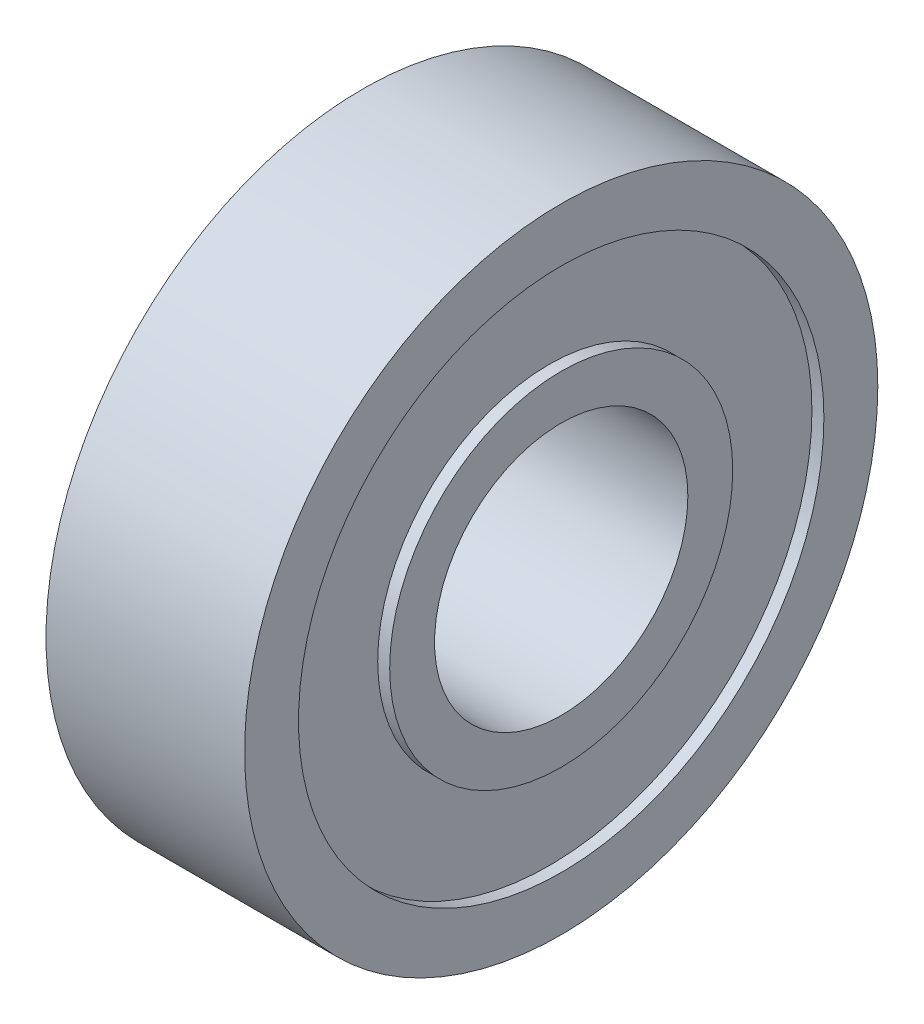
ISO-10303-21;
HEADER;
FILE_DESCRIPTION(('STEP AP214'),'2;1');
FILE_NAME('part.step','',(''),(''),'','','');
FILE_SCHEMA(('AUTOMOTIVE_DESIGN { 1 0 10303 214 1 1 1 1 }'));
ENDSEC;
DATA;
#1=APPLICATION_CONTEXT('core data for automotive mechanical design processes');
#2=APPLICATION_PROTOCOL_DEFINITION('international standard','automotive_design',2000,#1);
#3=PRODUCT_CONTEXT('',#1,'mechanical');
#4=PRODUCT('Part','Part','',(#3));
#5=PRODUCT_RELATED_PRODUCT_CATEGORY('part','',(#4));
#6=PRODUCT_DEFINITION_FORMATION('','',#4);
#7=PRODUCT_DEFINITION_CONTEXT('part definition',#1,'design');
#8=PRODUCT_DEFINITION('design','',#6,#7);
#9=PRODUCT_DEFINITION_SHAPE('','',#8);
#10=(LENGTH_UNIT() NAMED_UNIT(*) SI_UNIT(.MILLI.,.METRE.));
#11=(NAMED_UNIT(*) PLANE_ANGLE_UNIT() SI_UNIT($,.RADIAN.));
#12=(NAMED_UNIT(*) SI_UNIT($,.STERADIAN.) SOLID_ANGLE_UNIT());
#13=UNCERTAINTY_MEASURE_WITH_UNIT(LENGTH_MEASURE(1.E-05),#10,'distance_accuracy_value','');
#14=(GEOMETRIC_REPRESENTATION_CONTEXT(3) GLOBAL_UNCERTAINTY_ASSIGNED_CONTEXT((#13)) GLOBAL_UNIT_ASSIGNED_CONTEXT((#10,
#11,#12)) REPRESENTATION_CONTEXT('',''));
#15=CARTESIAN_POINT('',(0.,0.,0.));
#16=DIRECTION('',(0.,0.,1.));
#17=DIRECTION('',(1.,0.,0.));
#18=AXIS2_PLACEMENT_3D('',#15,#16,#17);
#19=CARTESIAN_POINT('',(-2.4892,3.175,0.));
#20=DIRECTION('',(-1.,0.,0.));
#21=DIRECTION('',(0.,0.,1.));
#22=AXIS2_PLACEMENT_3D('',#19,#20,#21);
#23=PLANE('',#22);
#24=CARTESIAN_POINT('',(-2.4892,0.,0.));
#25=DIRECTION('',(1.,0.,0.));
#26=DIRECTION('',(0.,0.,-1.));
#27=AXIS2_PLACEMENT_3D('',#24,#25,#26);
#28=CIRCLE('',#27,3.175);
#29=CARTESIAN_POINT('',(-2.4892,0.,-3.175));
#30=VERTEX_POINT('',#29);
#31=EDGE_CURVE('E72',#30,#30,#28,.T.);
#32=ORIENTED_EDGE('',*,*,#31,.T.);
#33=EDGE_LOOP('',(#32));
#34=FACE_BOUND('',#33,.T.);
#35=CARTESIAN_POINT('',(-2.4892,0.,0.));
#36=DIRECTION('',(1.,0.,0.));
#37=DIRECTION('',(0.,0.,-1.));
#38=AXIS2_PLACEMENT_3D('',#35,#36,#37);
#39=CIRCLE('',#38,4.3);
#40=CARTESIAN_POINT('',(-2.4892,0.,-4.3));
#41=VERTEX_POINT('',#40);
#42=EDGE_CURVE('E10',#41,#41,#39,.T.);
#43=ORIENTED_EDGE('',*,*,#42,.F.);
#44=EDGE_LOOP('',(#43));
#45=FACE_BOUND('',#44,.T.);
#46=ADVANCED_FACE('F32',(#34,#45),#23,.T.);
#47=CARTESIAN_POINT('',(0.,0.,0.));
#48=DIRECTION('',(1.,0.,0.));
#49=DIRECTION('',(0.,0.,-1.));
#50=AXIS2_PLACEMENT_3D('',#47,#48,#49);
#51=CYLINDRICAL_SURFACE('',#50,4.3);
#52=ORIENTED_EDGE('',*,*,#42,.T.);
#53=EDGE_LOOP('',(#52));
#54=FACE_BOUND('',#53,.T.);
#55=CARTESIAN_POINT('',(-2.1892,0.,0.));
#56=DIRECTION('',(1.,0.,0.));
#57=DIRECTION('',(0.,0.,-1.));
#58=AXIS2_PLACEMENT_3D('',#55,#56,#57);
#59=CIRCLE('',#58,4.3);
#60=CARTESIAN_POINT('',(-2.1892,0.,-4.3));
#61=VERTEX_POINT('',#60);
#62=EDGE_CURVE('E38',#61,#61,#59,.T.);
#63=ORIENTED_EDGE('',*,*,#62,.F.);
#64=EDGE_LOOP('',(#63));
#65=FACE_BOUND('',#64,.T.);
#66=ADVANCED_FACE('F90',(#54,#65),#51,.T.);
#67=CARTESIAN_POINT('',(-2.1892,4.3,0.));
#68=DIRECTION('',(-1.,0.,0.));
#69=DIRECTION('',(0.,0.,1.));
#70=AXIS2_PLACEMENT_3D('',#67,#68,#69);
#71=PLANE('',#70);
#72=ORIENTED_EDGE('',*,*,#62,.T.);
#73=EDGE_LOOP('',(#72));
#74=FACE_BOUND('',#73,.T.);
#75=CARTESIAN_POINT('',(-2.1892,0.,0.));
#76=DIRECTION('',(1.,0.,0.));
#77=DIRECTION('',(0.,0.,-1.));
#78=AXIS2_PLACEMENT_3D('',#75,#76,#77);
#79=CIRCLE('',#78,6.586);
#80=CARTESIAN_POINT('',(-2.1892,0.,-6.586));
#81=VERTEX_POINT('',#80);
#82=EDGE_CURVE('E42',#81,#81,#79,.T.);
#83=ORIENTED_EDGE('',*,*,#82,.F.);
#84=EDGE_LOOP('',(#83));
#85=FACE_BOUND('',#84,.T.);
#86=ADVANCED_FACE('F94',(#74,#85),#71,.T.);
#87=CARTESIAN_POINT('',(0.,0.,0.));
#88=DIRECTION('',(1.,0.,0.));
#89=DIRECTION('',(0.,0.,-1.));
#90=AXIS2_PLACEMENT_3D('',#87,#88,#89);
#91=CYLINDRICAL_SURFACE('',#90,6.586);
#92=ORIENTED_EDGE('',*,*,#82,.T.);
#93=EDGE_LOOP('',(#92));
#94=FACE_BOUND('',#93,.T.);
#95=CARTESIAN_POINT('',(-2.4892,0.,0.));
#96=DIRECTION('',(1.,0.,0.));
#97=DIRECTION('',(0.,0.,-1.));
#98=AXIS2_PLACEMENT_3D('',#95,#96,#97);
#99=CIRCLE('',#98,6.586);
#100=CARTESIAN_POINT('',(-2.4892,0.,-6.586));
#101=VERTEX_POINT('',#100);
#102=EDGE_CURVE('E46',#101,#101,#99,.T.);
#103=ORIENTED_EDGE('',*,*,#102,.F.);
#104=EDGE_LOOP('',(#103));
#105=FACE_BOUND('',#104,.T.);
#106=ADVANCED_FACE('F98',(#94,#105),#91,.F.);
#107=CARTESIAN_POINT('',(-2.4892,6.586,0.));
#108=DIRECTION('',(-1.,0.,0.));
#109=DIRECTION('',(0.,0.,1.));
#110=AXIS2_PLACEMENT_3D('',#107,#108,#109);
#111=PLANE('',#110);
#112=ORIENTED_EDGE('',*,*,#102,.T.);
#113=EDGE_LOOP('',(#112));
#114=FACE_BOUND('',#113,.T.);
#115=CARTESIAN_POINT('',(-2.4892,0.,0.));
#116=DIRECTION('',(1.,0.,0.));
#117=DIRECTION('',(0.,0.,-1.));
#118=AXIS2_PLACEMENT_3D('',#115,#116,#117);
#119=CIRCLE('',#118,7.9375);
#120=CARTESIAN_POINT('',(-2.4892,0.,-7.9375));
#121=VERTEX_POINT('',#120);
#122=EDGE_CURVE('E51',#121,#121,#119,.T.);
#123=ORIENTED_EDGE('',*,*,#122,.F.);
#124=EDGE_LOOP('',(#123));
#125=FACE_BOUND('',#124,.T.);
#126=ADVANCED_FACE('F104',(#114,#125),#111,.T.);
#127=CARTESIAN_POINT('',(0.,0.,0.));
#128=DIRECTION('',(1.,0.,0.));
#129=DIRECTION('',(0.,0.,-1.));
#130=AXIS2_PLACEMENT_3D('',#127,#128,#129);
#131=CYLINDRICAL_SURFACE('',#130,7.9375);
#132=ORIENTED_EDGE('',*,*,#122,.T.);
#133=EDGE_LOOP('',(#132));
#134=FACE_BOUND('',#133,.T.);
#135=CARTESIAN_POINT('',(2.4892,0.,0.));
#136=DIRECTION('',(1.,0.,0.));
#137=DIRECTION('',(0.,0.,-1.));
#138=AXIS2_PLACEMENT_3D('',#135,#136,#137);
#139=CIRCLE('',#138,7.9375);
#140=CARTESIAN_POINT('',(2.4892,0.,-7.9375));
#141=VERTEX_POINT('',#140);
#142=EDGE_CURVE('E54',#141,#141,#139,.T.);
#143=ORIENTED_EDGE('',*,*,#142,.F.);
#144=EDGE_LOOP('',(#143));
#145=FACE_BOUND('',#144,.T.);
#146=ADVANCED_FACE('F108',(#134,#145),#131,.T.);
#147=CARTESIAN_POINT('',(2.4892,6.586,0.));
#148=DIRECTION('',(1.,0.,0.));
#149=DIRECTION('',(0.,0.,-1.));
#150=AXIS2_PLACEMENT_3D('',#147,#148,#149);
#151=PLANE('',#150);
#152=ORIENTED_EDGE('',*,*,#142,.T.);
#153=EDGE_LOOP('',(#152));
#154=FACE_BOUND('',#153,.T.);
#155=CARTESIAN_POINT('',(2.4892,0.,0.));
#156=DIRECTION('',(1.,0.,0.));
#157=DIRECTION('',(0.,0.,-1.));
#158=AXIS2_PLACEMENT_3D('',#155,#156,#157);
#159=CIRCLE('',#158,6.586);
#160=CARTESIAN_POINT('',(2.4892,0.,-6.586));
#161=VERTEX_POINT('',#160);
#162=EDGE_CURVE('E57',#161,#161,#159,.T.);
#163=ORIENTED_EDGE('',*,*,#162,.F.);
#164=EDGE_LOOP('',(#163));
#165=FACE_BOUND('',#164,.T.);
#166=ADVANCED_FACE('F112',(#154,#165),#151,.T.);
#167=CARTESIAN_POINT('',(0.,0.,0.));
#168=DIRECTION('',(1.,0.,0.));
#169=DIRECTION('',(0.,0.,-1.));
#170=AXIS2_PLACEMENT_3D('',#167,#168,#169);
#171=CYLINDRICAL_SURFACE('',#170,6.586);
#172=ORIENTED_EDGE('',*,*,#162,.T.);
#173=EDGE_LOOP('',(#172));
#174=FACE_BOUND('',#173,.T.);
#175=CARTESIAN_POINT('',(2.1892,0.,0.));
#176=DIRECTION('',(1.,0.,0.));
#177=DIRECTION('',(0.,0.,-1.));
#178=AXIS2_PLACEMENT_3D('',#175,#176,#177);
#179=CIRCLE('',#178,6.586);
#180=CARTESIAN_POINT('',(2.1892,0.,-6.586));
#181=VERTEX_POINT('',#180);
#182=EDGE_CURVE('E60',#181,#181,#179,.T.);
#183=ORIENTED_EDGE('',*,*,#182,.F.);
#184=EDGE_LOOP('',(#183));
#185=FACE_BOUND('',#184,.T.);
#186=ADVANCED_FACE('F116',(#174,#185),#171,.F.);
#187=CARTESIAN_POINT('',(2.1892,4.3,0.));
#188=DIRECTION('',(1.,0.,0.));
#189=DIRECTION('',(0.,0.,-1.));
#190=AXIS2_PLACEMENT_3D('',#187,#188,#189);
#191=PLANE('',#190);
#192=ORIENTED_EDGE('',*,*,#182,.T.);
#193=EDGE_LOOP('',(#192));
#194=FACE_BOUND('',#193,.T.);
#195=CARTESIAN_POINT('',(2.1892,0.,0.));
#196=DIRECTION('',(1.,0.,0.));
#197=DIRECTION('',(0.,0.,-1.));
#198=AXIS2_PLACEMENT_3D('',#195,#196,#197);
#199=CIRCLE('',#198,4.3);
#200=CARTESIAN_POINT('',(2.1892,0.,-4.3));
#201=VERTEX_POINT('',#200);
#202=EDGE_CURVE('E63',#201,#201,#199,.T.);
#203=ORIENTED_EDGE('',*,*,#202,.F.);
#204=EDGE_LOOP('',(#203));
#205=FACE_BOUND('',#204,.T.);
#206=ADVANCED_FACE('F120',(#194,#205),#191,.T.);
#207=CARTESIAN_POINT('',(0.,0.,0.));
#208=DIRECTION('',(1.,0.,0.));
#209=DIRECTION('',(0.,0.,-1.));
#210=AXIS2_PLACEMENT_3D('',#207,#208,#209);
#211=CYLINDRICAL_SURFACE('',#210,4.3);
#212=ORIENTED_EDGE('',*,*,#202,.T.);
#213=EDGE_LOOP('',(#212));
#214=FACE_BOUND('',#213,.T.);
#215=CARTESIAN_POINT('',(2.4892,0.,0.));
#216=DIRECTION('',(1.,0.,0.));
#217=DIRECTION('',(0.,0.,-1.));
#218=AXIS2_PLACEMENT_3D('',#215,#216,#217);
#219=CIRCLE('',#218,4.3);
#220=CARTESIAN_POINT('',(2.4892,0.,-4.3));
#221=VERTEX_POINT('',#220);
#222=EDGE_CURVE('E66',#221,#221,#219,.T.);
#223=ORIENTED_EDGE('',*,*,#222,.F.);
#224=EDGE_LOOP('',(#223));
#225=FACE_BOUND('',#224,.T.);
#226=ADVANCED_FACE('F86',(#214,#225),#211,.T.);
#227=CARTESIAN_POINT('',(2.4892,3.175,0.));
#228=DIRECTION('',(1.,0.,0.));
#229=DIRECTION('',(0.,0.,-1.));
#230=AXIS2_PLACEMENT_3D('',#227,#228,#229);
#231=PLANE('',#230);
#232=ORIENTED_EDGE('',*,*,#222,.T.);
#233=EDGE_LOOP('',(#232));
#234=FACE_BOUND('',#233,.T.);
#235=CARTESIAN_POINT('',(2.4892,0.,0.));
#236=DIRECTION('',(1.,0.,0.));
#237=DIRECTION('',(0.,0.,-1.));
#238=AXIS2_PLACEMENT_3D('',#235,#236,#237);
#239=CIRCLE('',#238,3.175);
#240=CARTESIAN_POINT('',(2.4892,0.,-3.175));
#241=VERTEX_POINT('',#240);
#242=EDGE_CURVE('E69',#241,#241,#239,.T.);
#243=ORIENTED_EDGE('',*,*,#242,.F.);
#244=EDGE_LOOP('',(#243));
#245=FACE_BOUND('',#244,.T.);
#246=ADVANCED_FACE('F80',(#234,#245),#231,.T.);
#247=CARTESIAN_POINT('',(0.,0.,0.));
#248=DIRECTION('',(1.,0.,0.));
#249=DIRECTION('',(0.,0.,-1.));
#250=AXIS2_PLACEMENT_3D('',#247,#248,#249);
#251=CYLINDRICAL_SURFACE('',#250,3.175);
#252=ORIENTED_EDGE('',*,*,#242,.T.);
#253=EDGE_LOOP('',(#252));
#254=FACE_BOUND('',#253,.T.);
#255=ORIENTED_EDGE('',*,*,#31,.F.);
#256=EDGE_LOOP('',(#255));
#257=FACE_BOUND('',#256,.T.);
#258=ADVANCED_FACE('F78',(#254,#257),#251,.F.);
#259=CLOSED_SHELL('',(#46,#66,#86,#106,#126,#146,#166,#186,#206,#226,#246,#258));
#260=MANIFOLD_SOLID_BREP('B2',#259);
#261=ADVANCED_BREP_SHAPE_REPRESENTATION('',(#18,#260),#14);
#262=SHAPE_DEFINITION_REPRESENTATION(#9,#261);
ENDSEC;
END-ISO-10303-21;
